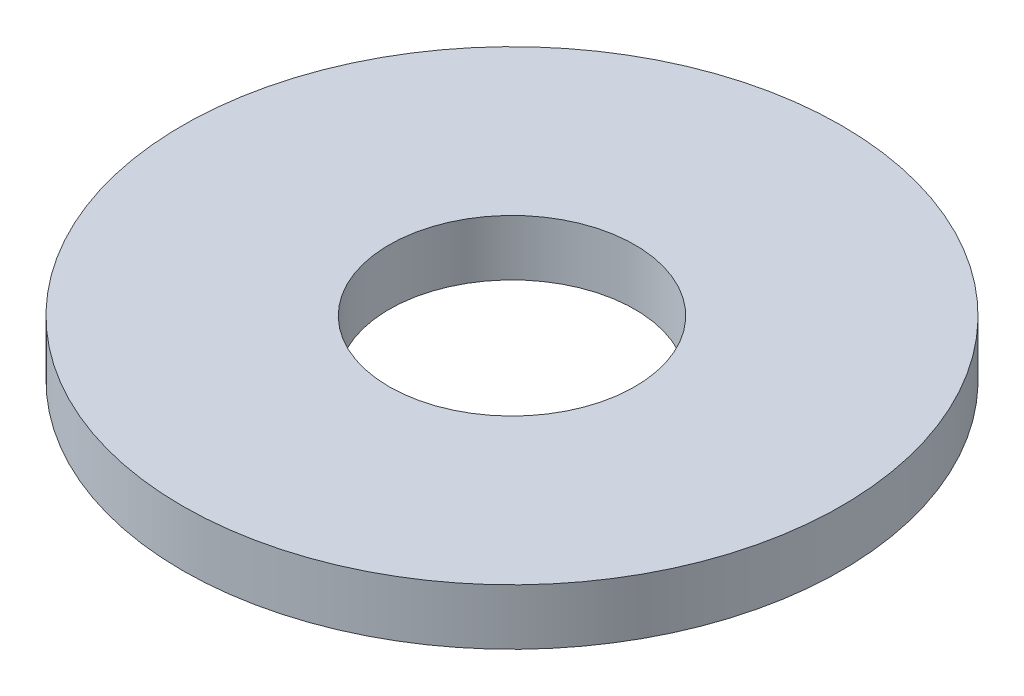
ISO-10303-21;
HEADER;
FILE_DESCRIPTION(('STEP AP214'),'2;1');
FILE_NAME('part.step','',(''),(''),'','','');
FILE_SCHEMA(('AUTOMOTIVE_DESIGN { 1 0 10303 214 1 1 1 1 }'));
ENDSEC;
DATA;
#1=APPLICATION_CONTEXT('core data for automotive mechanical design processes');
#2=APPLICATION_PROTOCOL_DEFINITION('international standard','automotive_design',2000,#1);
#3=PRODUCT_CONTEXT('',#1,'mechanical');
#4=PRODUCT('Part','Part','',(#3));
#5=PRODUCT_RELATED_PRODUCT_CATEGORY('part','',(#4));
#6=PRODUCT_DEFINITION_FORMATION('','',#4);
#7=PRODUCT_DEFINITION_CONTEXT('part definition',#1,'design');
#8=PRODUCT_DEFINITION('design','',#6,#7);
#9=PRODUCT_DEFINITION_SHAPE('','',#8);
#10=(LENGTH_UNIT() NAMED_UNIT(*) SI_UNIT(.MILLI.,.METRE.));
#11=(NAMED_UNIT(*) PLANE_ANGLE_UNIT() SI_UNIT($,.RADIAN.));
#12=(NAMED_UNIT(*) SI_UNIT($,.STERADIAN.) SOLID_ANGLE_UNIT());
#13=UNCERTAINTY_MEASURE_WITH_UNIT(LENGTH_MEASURE(1.E-05),#10,'distance_accuracy_value','');
#14=(GEOMETRIC_REPRESENTATION_CONTEXT(3) GLOBAL_UNCERTAINTY_ASSIGNED_CONTEXT((#13)) GLOBAL_UNIT_ASSIGNED_CONTEXT((#10,
#11,#12)) REPRESENTATION_CONTEXT('',''));
#15=CARTESIAN_POINT('',(0.,0.,0.));
#16=DIRECTION('',(0.,0.,1.));
#17=DIRECTION('',(1.,0.,0.));
#18=AXIS2_PLACEMENT_3D('',#15,#16,#17);
#19=CARTESIAN_POINT('',(0.,1.,0.));
#20=DIRECTION('',(0.,1.,0.));
#21=DIRECTION('',(0.,0.,1.));
#22=AXIS2_PLACEMENT_3D('',#19,#20,#21);
#23=PLANE('',#22);
#24=CARTESIAN_POINT('',(0.,1.,0.));
#25=DIRECTION('',(0.,1.,0.));
#26=DIRECTION('',(0.,0.,1.));
#27=AXIS2_PLACEMENT_3D('',#24,#25,#26);
#28=CIRCLE('',#27,5.9);
#29=CARTESIAN_POINT('',(0.,1.,5.9));
#30=VERTEX_POINT('',#29);
#31=EDGE_CURVE('E10',#30,#30,#28,.T.);
#32=ORIENTED_EDGE('',*,*,#31,.T.);
#33=EDGE_LOOP('',(#32));
#34=FACE_BOUND('',#33,.T.);
#35=CARTESIAN_POINT('',(0.,1.,0.));
#36=DIRECTION('',(0.,1.,0.));
#37=DIRECTION('',(0.,0.,1.));
#38=AXIS2_PLACEMENT_3D('',#35,#36,#37);
#39=CIRCLE('',#38,2.2);
#40=CARTESIAN_POINT('',(0.,1.,2.2));
#41=VERTEX_POINT('',#40);
#42=EDGE_CURVE('E50',#41,#41,#39,.T.);
#43=ORIENTED_EDGE('',*,*,#42,.F.);
#44=EDGE_LOOP('',(#43));
#45=FACE_BOUND('',#44,.T.);
#46=ADVANCED_FACE('F37',(#34,#45),#23,.T.);
#47=CARTESIAN_POINT('',(0.,0.,0.));
#48=DIRECTION('',(0.,1.,0.));
#49=DIRECTION('',(0.,0.,1.));
#50=AXIS2_PLACEMENT_3D('',#47,#48,#49);
#51=PLANE('',#50);
#52=CARTESIAN_POINT('',(0.,0.,0.));
#53=DIRECTION('',(0.,1.,0.));
#54=DIRECTION('',(0.,0.,1.));
#55=AXIS2_PLACEMENT_3D('',#52,#53,#54);
#56=CIRCLE('',#55,5.9);
#57=CARTESIAN_POINT('',(0.,0.,5.9));
#58=VERTEX_POINT('',#57);
#59=EDGE_CURVE('E41',#58,#58,#56,.T.);
#60=ORIENTED_EDGE('',*,*,#59,.F.);
#61=EDGE_LOOP('',(#60));
#62=FACE_BOUND('',#61,.T.);
#63=CARTESIAN_POINT('',(0.,0.,0.));
#64=DIRECTION('',(0.,1.,0.));
#65=DIRECTION('',(0.,0.,1.));
#66=AXIS2_PLACEMENT_3D('',#63,#64,#65);
#67=CIRCLE('',#66,2.2);
#68=CARTESIAN_POINT('',(0.,0.,2.2));
#69=VERTEX_POINT('',#68);
#70=EDGE_CURVE('E52',#69,#69,#67,.T.);
#71=ORIENTED_EDGE('',*,*,#70,.T.);
#72=EDGE_LOOP('',(#71));
#73=FACE_BOUND('',#72,.T.);
#74=ADVANCED_FACE('F64',(#62,#73),#51,.F.);
#75=CARTESIAN_POINT('',(0.,1.,0.));
#76=DIRECTION('',(0.,-1.,0.));
#77=DIRECTION('',(0.,0.,-1.));
#78=AXIS2_PLACEMENT_3D('',#75,#76,#77);
#79=CYLINDRICAL_SURFACE('',#78,5.9);
#80=ORIENTED_EDGE('',*,*,#31,.F.);
#81=EDGE_LOOP('',(#80));
#82=FACE_BOUND('',#81,.T.);
#83=ORIENTED_EDGE('',*,*,#59,.T.);
#84=EDGE_LOOP('',(#83));
#85=FACE_BOUND('',#84,.T.);
#86=ADVANCED_FACE('F39',(#82,#85),#79,.T.);
#87=CARTESIAN_POINT('',(0.,1.,0.));
#88=DIRECTION('',(0.,-1.,0.));
#89=DIRECTION('',(0.,0.,-1.));
#90=AXIS2_PLACEMENT_3D('',#87,#88,#89);
#91=CYLINDRICAL_SURFACE('',#90,2.2);
#92=ORIENTED_EDGE('',*,*,#42,.T.);
#93=EDGE_LOOP('',(#92));
#94=FACE_BOUND('',#93,.T.);
#95=ORIENTED_EDGE('',*,*,#70,.F.);
#96=EDGE_LOOP('',(#95));
#97=FACE_BOUND('',#96,.T.);
#98=ADVANCED_FACE('F60',(#94,#97),#91,.F.);
#99=CLOSED_SHELL('',(#46,#74,#86,#98));
#100=MANIFOLD_SOLID_BREP('B2',#99);
#101=ADVANCED_BREP_SHAPE_REPRESENTATION('',(#18,#100),#14);
#102=SHAPE_DEFINITION_REPRESENTATION(#9,#101);
ENDSEC;
END-ISO-10303-21;
